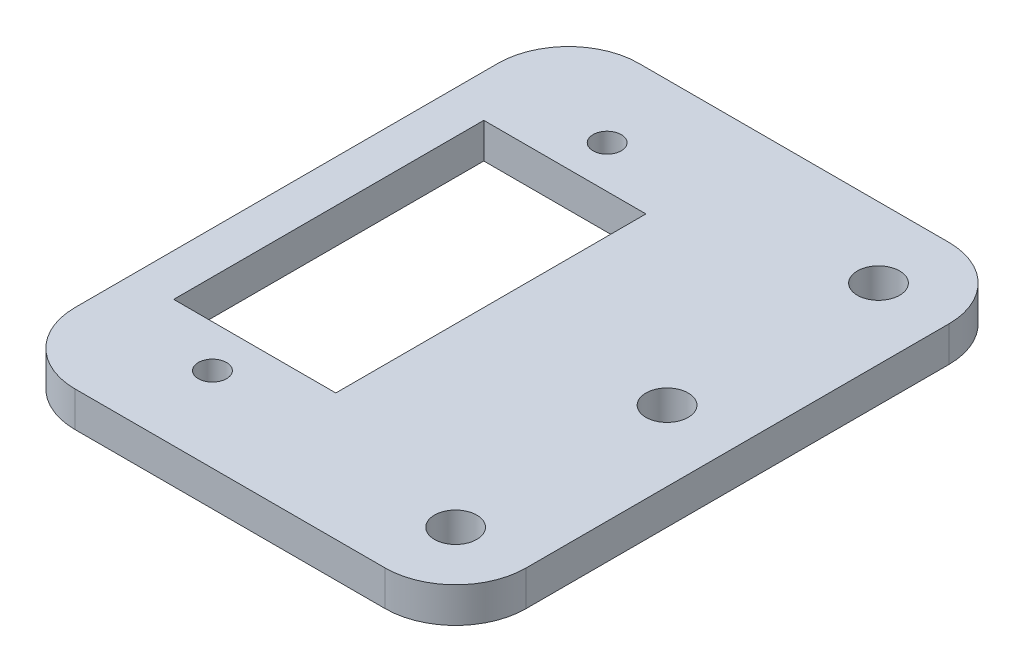
ISO-10303-21;
HEADER;
FILE_DESCRIPTION(('STEP AP214'),'2;1');
FILE_NAME('part.step','',(''),(''),'','','');
FILE_SCHEMA(('AUTOMOTIVE_DESIGN { 1 0 10303 214 1 1 1 1 }'));
ENDSEC;
DATA;
#1=APPLICATION_CONTEXT('core data for automotive mechanical design processes');
#2=APPLICATION_PROTOCOL_DEFINITION('international standard','automotive_design',2000,#1);
#3=PRODUCT_CONTEXT('',#1,'mechanical');
#4=PRODUCT('Part','Part','',(#3));
#5=PRODUCT_RELATED_PRODUCT_CATEGORY('part','',(#4));
#6=PRODUCT_DEFINITION_FORMATION('','',#4);
#7=PRODUCT_DEFINITION_CONTEXT('part definition',#1,'design');
#8=PRODUCT_DEFINITION('design','',#6,#7);
#9=PRODUCT_DEFINITION_SHAPE('','',#8);
#10=(LENGTH_UNIT() NAMED_UNIT(*) SI_UNIT(.MILLI.,.METRE.));
#11=(NAMED_UNIT(*) PLANE_ANGLE_UNIT() SI_UNIT($,.RADIAN.));
#12=(NAMED_UNIT(*) SI_UNIT($,.STERADIAN.) SOLID_ANGLE_UNIT());
#13=UNCERTAINTY_MEASURE_WITH_UNIT(LENGTH_MEASURE(1.E-05),#10,'distance_accuracy_value','');
#14=(GEOMETRIC_REPRESENTATION_CONTEXT(3) GLOBAL_UNCERTAINTY_ASSIGNED_CONTEXT((#13)) GLOBAL_UNIT_ASSIGNED_CONTEXT((#10,
#11,#12)) REPRESENTATION_CONTEXT('',''));
#15=CARTESIAN_POINT('',(0.,0.,0.));
#16=DIRECTION('',(0.,0.,1.));
#17=DIRECTION('',(1.,0.,0.));
#18=AXIS2_PLACEMENT_3D('',#15,#16,#17);
#19=CARTESIAN_POINT('',(0.,2.5,0.));
#20=DIRECTION('',(0.,1.,0.));
#21=DIRECTION('',(0.,0.,1.));
#22=AXIS2_PLACEMENT_3D('',#19,#20,#21);
#23=PLANE('',#22);
#24=DIRECTION('',(1.,0.,0.));
#25=VECTOR('',#24,1.);
#26=CARTESIAN_POINT('',(-13.,2.5,11.));
#27=LINE('',#26,#25);
#28=CARTESIAN_POINT('',(-13.,2.5,11.));
#29=VERTEX_POINT('',#28);
#30=CARTESIAN_POINT('',(-1.5,2.5,11.));
#31=VERTEX_POINT('',#30);
#32=EDGE_CURVE('E133',#29,#31,#27,.T.);
#33=ORIENTED_EDGE('',*,*,#32,.F.);
#34=DIRECTION('',(0.,0.,1.));
#35=VECTOR('',#34,1.);
#36=CARTESIAN_POINT('',(-13.,2.5,-11.));
#37=LINE('',#36,#35);
#38=CARTESIAN_POINT('',(-13.,2.5,-11.));
#39=VERTEX_POINT('',#38);
#40=EDGE_CURVE('E123',#39,#29,#37,.T.);
#41=ORIENTED_EDGE('',*,*,#40,.F.);
#42=DIRECTION('',(-1.,0.,0.));
#43=VECTOR('',#42,1.);
#44=CARTESIAN_POINT('',(-13.,2.5,-11.));
#45=LINE('',#44,#43);
#46=CARTESIAN_POINT('',(-1.5,2.5,-11.));
#47=VERTEX_POINT('',#46);
#48=EDGE_CURVE('E149',#47,#39,#45,.T.);
#49=ORIENTED_EDGE('',*,*,#48,.F.);
#50=DIRECTION('',(0.,0.,-1.));
#51=VECTOR('',#50,1.);
#52=CARTESIAN_POINT('',(-1.5,2.5,-11.));
#53=LINE('',#52,#51);
#54=EDGE_CURVE('E147',#31,#47,#53,.T.);
#55=ORIENTED_EDGE('',*,*,#54,.F.);
#56=EDGE_LOOP('',(#33,#41,#49,#55));
#57=FACE_BOUND('',#56,.T.);
#58=CARTESIAN_POINT('',(11.0000000000003,2.5,15.));
#59=DIRECTION('',(0.,1.,0.));
#60=DIRECTION('',(0.,0.,1.));
#61=AXIS2_PLACEMENT_3D('',#58,#59,#60);
#62=CIRCLE('',#61,1.5);
#63=CARTESIAN_POINT('',(11.0000000000003,2.5,16.5));
#64=VERTEX_POINT('',#63);
#65=EDGE_CURVE('E167',#64,#64,#62,.T.);
#66=ORIENTED_EDGE('',*,*,#65,.F.);
#67=EDGE_LOOP('',(#66));
#68=FACE_BOUND('',#67,.T.);
#69=CARTESIAN_POINT('',(-7.25,2.5,14.));
#70=DIRECTION('',(0.,1.,0.));
#71=DIRECTION('',(0.,0.,1.));
#72=AXIS2_PLACEMENT_3D('',#69,#70,#71);
#73=CIRCLE('',#72,1.);
#74=CARTESIAN_POINT('',(-7.25,2.5,15.));
#75=VERTEX_POINT('',#74);
#76=EDGE_CURVE('E179',#75,#75,#73,.T.);
#77=ORIENTED_EDGE('',*,*,#76,.F.);
#78=EDGE_LOOP('',(#77));
#79=FACE_BOUND('',#78,.T.);
#80=DIRECTION('',(-1.,0.,0.));
#81=VECTOR('',#80,1.);
#82=CARTESIAN_POINT('',(-16.,2.5,-20.));
#83=LINE('',#82,#81);
#84=CARTESIAN_POINT('',(11.,2.5,-20.));
#85=VERTEX_POINT('',#84);
#86=CARTESIAN_POINT('',(-11.,2.5,-20.));
#87=VERTEX_POINT('',#86);
#88=EDGE_CURVE('E199',#85,#87,#83,.T.);
#89=ORIENTED_EDGE('',*,*,#88,.T.);
#90=CARTESIAN_POINT('',(-11.,2.5,-15.));
#91=DIRECTION('',(0.,1.,0.));
#92=DIRECTION('',(0.,0.,1.));
#93=AXIS2_PLACEMENT_3D('',#90,#91,#92);
#94=CIRCLE('',#93,5.);
#95=CARTESIAN_POINT('',(-16.,2.5,-15.));
#96=VERTEX_POINT('',#95);
#97=EDGE_CURVE('E234',#87,#96,#94,.T.);
#98=ORIENTED_EDGE('',*,*,#97,.T.);
#99=DIRECTION('',(0.,0.,1.));
#100=VECTOR('',#99,1.);
#101=CARTESIAN_POINT('',(-16.,2.5,-20.));
#102=LINE('',#101,#100);
#103=CARTESIAN_POINT('',(-16.,2.5,15.));
#104=VERTEX_POINT('',#103);
#105=EDGE_CURVE('E191',#96,#104,#102,.T.);
#106=ORIENTED_EDGE('',*,*,#105,.T.);
#107=CARTESIAN_POINT('',(-11.,2.5,15.));
#108=DIRECTION('',(0.,1.,0.));
#109=DIRECTION('',(0.,0.,1.));
#110=AXIS2_PLACEMENT_3D('',#107,#108,#109);
#111=CIRCLE('',#110,5.);
#112=CARTESIAN_POINT('',(-11.,2.5,20.));
#113=VERTEX_POINT('',#112);
#114=EDGE_CURVE('E229',#104,#113,#111,.T.);
#115=ORIENTED_EDGE('',*,*,#114,.T.);
#116=DIRECTION('',(1.,0.,0.));
#117=VECTOR('',#116,1.);
#118=CARTESIAN_POINT('',(-16.,2.5,20.));
#119=LINE('',#118,#117);
#120=CARTESIAN_POINT('',(11.,2.5,20.));
#121=VERTEX_POINT('',#120);
#122=EDGE_CURVE('E194',#113,#121,#119,.T.);
#123=ORIENTED_EDGE('',*,*,#122,.T.);
#124=CARTESIAN_POINT('',(11.,2.5,15.));
#125=DIRECTION('',(0.,1.,0.));
#126=DIRECTION('',(0.,0.,1.));
#127=AXIS2_PLACEMENT_3D('',#124,#125,#126);
#128=CIRCLE('',#127,5.);
#129=CARTESIAN_POINT('',(16.,2.5,15.));
#130=VERTEX_POINT('',#129);
#131=EDGE_CURVE('E54',#121,#130,#128,.T.);
#132=ORIENTED_EDGE('',*,*,#131,.T.);
#133=DIRECTION('',(0.,0.,-1.));
#134=VECTOR('',#133,1.);
#135=CARTESIAN_POINT('',(16.,2.5,-20.));
#136=LINE('',#135,#134);
#137=CARTESIAN_POINT('',(16.,2.5,-15.));
#138=VERTEX_POINT('',#137);
#139=EDGE_CURVE('E197',#130,#138,#136,.T.);
#140=ORIENTED_EDGE('',*,*,#139,.T.);
#141=CARTESIAN_POINT('',(11.,2.5,-15.));
#142=DIRECTION('',(0.,1.,0.));
#143=DIRECTION('',(0.,0.,1.));
#144=AXIS2_PLACEMENT_3D('',#141,#142,#143);
#145=CIRCLE('',#144,5.);
#146=EDGE_CURVE('E232',#138,#85,#145,.T.);
#147=ORIENTED_EDGE('',*,*,#146,.T.);
#148=EDGE_LOOP('',(#89,#98,#106,#115,#123,#132,#140,#147));
#149=FACE_BOUND('',#148,.T.);
#150=CARTESIAN_POINT('',(11.,2.5,-15.));
#151=DIRECTION('',(0.,1.,0.));
#152=DIRECTION('',(0.,0.,1.));
#153=AXIS2_PLACEMENT_3D('',#150,#151,#152);
#154=CIRCLE('',#153,1.5);
#155=CARTESIAN_POINT('',(11.,2.5,-13.5));
#156=VERTEX_POINT('',#155);
#157=EDGE_CURVE('E185',#156,#156,#154,.T.);
#158=ORIENTED_EDGE('',*,*,#157,.F.);
#159=EDGE_LOOP('',(#158));
#160=FACE_BOUND('',#159,.T.);
#161=CARTESIAN_POINT('',(11.0000000000002,2.5,0.));
#162=DIRECTION('',(0.,1.,0.));
#163=DIRECTION('',(0.,0.,1.));
#164=AXIS2_PLACEMENT_3D('',#161,#162,#163);
#165=CIRCLE('',#164,1.5);
#166=CARTESIAN_POINT('',(11.0000000000002,2.5,1.5));
#167=VERTEX_POINT('',#166);
#168=EDGE_CURVE('E173',#167,#167,#165,.T.);
#169=ORIENTED_EDGE('',*,*,#168,.F.);
#170=EDGE_LOOP('',(#169));
#171=FACE_BOUND('',#170,.T.);
#172=CARTESIAN_POINT('',(-7.25,2.5,-14.));
#173=DIRECTION('',(0.,1.,0.));
#174=DIRECTION('',(0.,0.,-1.));
#175=AXIS2_PLACEMENT_3D('',#172,#173,#174);
#176=CIRCLE('',#175,1.);
#177=CARTESIAN_POINT('',(-7.25,2.5,-15.));
#178=VERTEX_POINT('',#177);
#179=EDGE_CURVE('E156',#178,#178,#176,.T.);
#180=ORIENTED_EDGE('',*,*,#179,.F.);
#181=EDGE_LOOP('',(#180));
#182=FACE_BOUND('',#181,.T.);
#183=ADVANCED_FACE('F32',(#57,#68,#79,#149,#160,#171,#182),#23,.T.);
#184=CARTESIAN_POINT('',(0.,0.,0.));
#185=DIRECTION('',(0.,1.,0.));
#186=DIRECTION('',(0.,0.,1.));
#187=AXIS2_PLACEMENT_3D('',#184,#185,#186);
#188=PLANE('',#187);
#189=CARTESIAN_POINT('',(11.0000000000003,0.,15.));
#190=DIRECTION('',(0.,1.,0.));
#191=DIRECTION('',(0.,0.,1.));
#192=AXIS2_PLACEMENT_3D('',#189,#190,#191);
#193=CIRCLE('',#192,1.5);
#194=CARTESIAN_POINT('',(11.0000000000003,0.,16.5));
#195=VERTEX_POINT('',#194);
#196=EDGE_CURVE('E141',#195,#195,#193,.T.);
#197=ORIENTED_EDGE('',*,*,#196,.T.);
#198=EDGE_LOOP('',(#197));
#199=FACE_BOUND('',#198,.T.);
#200=CARTESIAN_POINT('',(11.0000000000002,0.,0.));
#201=DIRECTION('',(0.,1.,0.));
#202=DIRECTION('',(0.,0.,1.));
#203=AXIS2_PLACEMENT_3D('',#200,#201,#202);
#204=CIRCLE('',#203,1.5);
#205=CARTESIAN_POINT('',(11.0000000000002,0.,1.5));
#206=VERTEX_POINT('',#205);
#207=EDGE_CURVE('E170',#206,#206,#204,.T.);
#208=ORIENTED_EDGE('',*,*,#207,.T.);
#209=EDGE_LOOP('',(#208));
#210=FACE_BOUND('',#209,.T.);
#211=CARTESIAN_POINT('',(-7.25,0.,14.));
#212=DIRECTION('',(0.,1.,0.));
#213=DIRECTION('',(0.,0.,1.));
#214=AXIS2_PLACEMENT_3D('',#211,#212,#213);
#215=CIRCLE('',#214,1.);
#216=CARTESIAN_POINT('',(-7.25,0.,15.));
#217=VERTEX_POINT('',#216);
#218=EDGE_CURVE('E176',#217,#217,#215,.T.);
#219=ORIENTED_EDGE('',*,*,#218,.T.);
#220=EDGE_LOOP('',(#219));
#221=FACE_BOUND('',#220,.T.);
#222=CARTESIAN_POINT('',(11.,0.,-15.));
#223=DIRECTION('',(0.,1.,0.));
#224=DIRECTION('',(0.,0.,1.));
#225=AXIS2_PLACEMENT_3D('',#222,#223,#224);
#226=CIRCLE('',#225,1.5);
#227=CARTESIAN_POINT('',(11.,0.,-13.5));
#228=VERTEX_POINT('',#227);
#229=EDGE_CURVE('E182',#228,#228,#226,.T.);
#230=ORIENTED_EDGE('',*,*,#229,.T.);
#231=EDGE_LOOP('',(#230));
#232=FACE_BOUND('',#231,.T.);
#233=DIRECTION('',(0.,0.,1.));
#234=VECTOR('',#233,1.);
#235=CARTESIAN_POINT('',(-16.,0.,-20.));
#236=LINE('',#235,#234);
#237=CARTESIAN_POINT('',(-16.,0.,-15.));
#238=VERTEX_POINT('',#237);
#239=CARTESIAN_POINT('',(-16.,0.,15.));
#240=VERTEX_POINT('',#239);
#241=EDGE_CURVE('E188',#238,#240,#236,.T.);
#242=ORIENTED_EDGE('',*,*,#241,.F.);
#243=CARTESIAN_POINT('',(-11.,0.,-15.));
#244=DIRECTION('',(0.,1.,0.));
#245=DIRECTION('',(0.,0.,1.));
#246=AXIS2_PLACEMENT_3D('',#243,#244,#245);
#247=CIRCLE('',#246,5.);
#248=CARTESIAN_POINT('',(-11.,0.,-20.));
#249=VERTEX_POINT('',#248);
#250=EDGE_CURVE('E222',#238,#249,#247,.F.);
#251=ORIENTED_EDGE('',*,*,#250,.T.);
#252=DIRECTION('',(-1.,0.,0.));
#253=VECTOR('',#252,1.);
#254=CARTESIAN_POINT('',(-16.,0.,-20.));
#255=LINE('',#254,#253);
#256=CARTESIAN_POINT('',(11.,0.,-20.));
#257=VERTEX_POINT('',#256);
#258=EDGE_CURVE('E195',#257,#249,#255,.T.);
#259=ORIENTED_EDGE('',*,*,#258,.F.);
#260=CARTESIAN_POINT('',(11.,0.,-15.));
#261=DIRECTION('',(0.,1.,0.));
#262=DIRECTION('',(0.,0.,1.));
#263=AXIS2_PLACEMENT_3D('',#260,#261,#262);
#264=CIRCLE('',#263,5.);
#265=CARTESIAN_POINT('',(16.,0.,-15.));
#266=VERTEX_POINT('',#265);
#267=EDGE_CURVE('E220',#257,#266,#264,.F.);
#268=ORIENTED_EDGE('',*,*,#267,.T.);
#269=DIRECTION('',(0.,0.,-1.));
#270=VECTOR('',#269,1.);
#271=CARTESIAN_POINT('',(16.,0.,-20.));
#272=LINE('',#271,#270);
#273=CARTESIAN_POINT('',(16.,0.,15.));
#274=VERTEX_POINT('',#273);
#275=EDGE_CURVE('E208',#274,#266,#272,.T.);
#276=ORIENTED_EDGE('',*,*,#275,.F.);
#277=CARTESIAN_POINT('',(11.,0.,15.));
#278=DIRECTION('',(0.,1.,0.));
#279=DIRECTION('',(0.,0.,1.));
#280=AXIS2_PLACEMENT_3D('',#277,#278,#279);
#281=CIRCLE('',#280,5.);
#282=CARTESIAN_POINT('',(11.,0.,20.));
#283=VERTEX_POINT('',#282);
#284=EDGE_CURVE('E218',#274,#283,#281,.F.);
#285=ORIENTED_EDGE('',*,*,#284,.T.);
#286=DIRECTION('',(1.,0.,0.));
#287=VECTOR('',#286,1.);
#288=CARTESIAN_POINT('',(-16.,0.,20.));
#289=LINE('',#288,#287);
#290=CARTESIAN_POINT('',(-11.,0.,20.));
#291=VERTEX_POINT('',#290);
#292=EDGE_CURVE('E205',#291,#283,#289,.T.);
#293=ORIENTED_EDGE('',*,*,#292,.F.);
#294=CARTESIAN_POINT('',(-11.,0.,15.));
#295=DIRECTION('',(0.,1.,0.));
#296=DIRECTION('',(0.,0.,1.));
#297=AXIS2_PLACEMENT_3D('',#294,#295,#296);
#298=CIRCLE('',#297,5.);
#299=EDGE_CURVE('E216',#291,#240,#298,.F.);
#300=ORIENTED_EDGE('',*,*,#299,.T.);
#301=EDGE_LOOP('',(#242,#251,#259,#268,#276,#285,#293,#300));
#302=FACE_BOUND('',#301,.T.);
#303=DIRECTION('',(0.,0.,1.));
#304=VECTOR('',#303,1.);
#305=CARTESIAN_POINT('',(-13.,0.,-11.));
#306=LINE('',#305,#304);
#307=CARTESIAN_POINT('',(-13.,0.,-11.));
#308=VERTEX_POINT('',#307);
#309=CARTESIAN_POINT('',(-13.,0.,11.));
#310=VERTEX_POINT('',#309);
#311=EDGE_CURVE('E154',#308,#310,#306,.T.);
#312=ORIENTED_EDGE('',*,*,#311,.T.);
#313=DIRECTION('',(1.,0.,0.));
#314=VECTOR('',#313,1.);
#315=CARTESIAN_POINT('',(-13.,0.,11.));
#316=LINE('',#315,#314);
#317=CARTESIAN_POINT('',(-1.5,0.,11.));
#318=VERTEX_POINT('',#317);
#319=EDGE_CURVE('E140',#310,#318,#316,.T.);
#320=ORIENTED_EDGE('',*,*,#319,.T.);
#321=DIRECTION('',(0.,0.,-1.));
#322=VECTOR('',#321,1.);
#323=CARTESIAN_POINT('',(-1.5,0.,-11.));
#324=LINE('',#323,#322);
#325=CARTESIAN_POINT('',(-1.5,0.,-11.));
#326=VERTEX_POINT('',#325);
#327=EDGE_CURVE('E158',#318,#326,#324,.T.);
#328=ORIENTED_EDGE('',*,*,#327,.T.);
#329=DIRECTION('',(-1.,0.,0.));
#330=VECTOR('',#329,1.);
#331=CARTESIAN_POINT('',(-13.,0.,-11.));
#332=LINE('',#331,#330);
#333=EDGE_CURVE('E134',#326,#308,#332,.T.);
#334=ORIENTED_EDGE('',*,*,#333,.T.);
#335=EDGE_LOOP('',(#312,#320,#328,#334));
#336=FACE_BOUND('',#335,.T.);
#337=CARTESIAN_POINT('',(-7.25,0.,-14.));
#338=DIRECTION('',(0.,1.,0.));
#339=DIRECTION('',(0.,0.,-1.));
#340=AXIS2_PLACEMENT_3D('',#337,#338,#339);
#341=CIRCLE('',#340,1.);
#342=CARTESIAN_POINT('',(-7.25,0.,-15.));
#343=VERTEX_POINT('',#342);
#344=EDGE_CURVE('E449',#343,#343,#341,.T.);
#345=ORIENTED_EDGE('',*,*,#344,.T.);
#346=EDGE_LOOP('',(#345));
#347=FACE_BOUND('',#346,.T.);
#348=ADVANCED_FACE('F250',(#199,#210,#221,#232,#302,#336,#347),#188,.F.);
#349=CARTESIAN_POINT('',(-16.,2.5,-20.));
#350=DIRECTION('',(1.,0.,0.));
#351=DIRECTION('',(0.,0.,-1.));
#352=AXIS2_PLACEMENT_3D('',#349,#350,#351);
#353=PLANE('',#352);
#354=ORIENTED_EDGE('',*,*,#105,.F.);
#355=DIRECTION('',(0.,-1.,0.));
#356=VECTOR('',#355,1.);
#357=CARTESIAN_POINT('',(-16.,2.5,-15.));
#358=LINE('',#357,#356);
#359=EDGE_CURVE('E213',#96,#238,#358,.T.);
#360=ORIENTED_EDGE('',*,*,#359,.T.);
#361=ORIENTED_EDGE('',*,*,#241,.T.);
#362=DIRECTION('',(0.,-1.,0.));
#363=VECTOR('',#362,1.);
#364=CARTESIAN_POINT('',(-16.,2.5,15.));
#365=LINE('',#364,#363);
#366=EDGE_CURVE('E202',#240,#104,#365,.F.);
#367=ORIENTED_EDGE('',*,*,#366,.T.);
#368=EDGE_LOOP('',(#354,#360,#361,#367));
#369=FACE_BOUND('',#368,.T.);
#370=ADVANCED_FACE('F273',(#369),#353,.F.);
#371=CARTESIAN_POINT('',(-16.,2.5,20.));
#372=DIRECTION('',(0.,0.,-1.));
#373=DIRECTION('',(-1.,0.,0.));
#374=AXIS2_PLACEMENT_3D('',#371,#372,#373);
#375=PLANE('',#374);
#376=ORIENTED_EDGE('',*,*,#292,.T.);
#377=DIRECTION('',(0.,-1.,0.));
#378=VECTOR('',#377,1.);
#379=CARTESIAN_POINT('',(11.,2.5,20.));
#380=LINE('',#379,#378);
#381=EDGE_CURVE('E11',#283,#121,#380,.F.);
#382=ORIENTED_EDGE('',*,*,#381,.T.);
#383=ORIENTED_EDGE('',*,*,#122,.F.);
#384=DIRECTION('',(0.,-1.,0.));
#385=VECTOR('',#384,1.);
#386=CARTESIAN_POINT('',(-11.,2.5,20.));
#387=LINE('',#386,#385);
#388=EDGE_CURVE('E40',#113,#291,#387,.T.);
#389=ORIENTED_EDGE('',*,*,#388,.T.);
#390=EDGE_LOOP('',(#376,#382,#383,#389));
#391=FACE_BOUND('',#390,.T.);
#392=ADVANCED_FACE('F244',(#391),#375,.F.);
#393=CARTESIAN_POINT('',(16.,2.5,-20.));
#394=DIRECTION('',(-1.,0.,0.));
#395=DIRECTION('',(0.,0.,1.));
#396=AXIS2_PLACEMENT_3D('',#393,#394,#395);
#397=PLANE('',#396);
#398=ORIENTED_EDGE('',*,*,#275,.T.);
#399=DIRECTION('',(0.,-1.,0.));
#400=VECTOR('',#399,1.);
#401=CARTESIAN_POINT('',(16.,2.5,-15.));
#402=LINE('',#401,#400);
#403=EDGE_CURVE('E47',#266,#138,#402,.F.);
#404=ORIENTED_EDGE('',*,*,#403,.T.);
#405=ORIENTED_EDGE('',*,*,#139,.F.);
#406=DIRECTION('',(0.,-1.,0.));
#407=VECTOR('',#406,1.);
#408=CARTESIAN_POINT('',(16.,2.5,15.));
#409=LINE('',#408,#407);
#410=EDGE_CURVE('E236',#130,#274,#409,.T.);
#411=ORIENTED_EDGE('',*,*,#410,.T.);
#412=EDGE_LOOP('',(#398,#404,#405,#411));
#413=FACE_BOUND('',#412,.T.);
#414=ADVANCED_FACE('F256',(#413),#397,.F.);
#415=CARTESIAN_POINT('',(-16.,2.5,-20.));
#416=DIRECTION('',(0.,0.,1.));
#417=DIRECTION('',(1.,0.,0.));
#418=AXIS2_PLACEMENT_3D('',#415,#416,#417);
#419=PLANE('',#418);
#420=ORIENTED_EDGE('',*,*,#258,.T.);
#421=DIRECTION('',(0.,-1.,0.));
#422=VECTOR('',#421,1.);
#423=CARTESIAN_POINT('',(-11.,2.5,-20.));
#424=LINE('',#423,#422);
#425=EDGE_CURVE('E227',#249,#87,#424,.F.);
#426=ORIENTED_EDGE('',*,*,#425,.T.);
#427=ORIENTED_EDGE('',*,*,#88,.F.);
#428=DIRECTION('',(0.,-1.,0.));
#429=VECTOR('',#428,1.);
#430=CARTESIAN_POINT('',(11.,2.5,-20.));
#431=LINE('',#430,#429);
#432=EDGE_CURVE('E224',#85,#257,#431,.T.);
#433=ORIENTED_EDGE('',*,*,#432,.T.);
#434=EDGE_LOOP('',(#420,#426,#427,#433));
#435=FACE_BOUND('',#434,.T.);
#436=ADVANCED_FACE('F265',(#435),#419,.F.);
#437=CARTESIAN_POINT('',(11.,2.5,-15.));
#438=DIRECTION('',(0.,-1.,0.));
#439=DIRECTION('',(0.,0.,-1.));
#440=AXIS2_PLACEMENT_3D('',#437,#438,#439);
#441=CYLINDRICAL_SURFACE('',#440,1.5);
#442=ORIENTED_EDGE('',*,*,#157,.T.);
#443=EDGE_LOOP('',(#442));
#444=FACE_BOUND('',#443,.T.);
#445=ORIENTED_EDGE('',*,*,#229,.F.);
#446=EDGE_LOOP('',(#445));
#447=FACE_BOUND('',#446,.T.);
#448=ADVANCED_FACE('F287',(#444,#447),#441,.F.);
#449=CARTESIAN_POINT('',(-7.25,2.5,14.));
#450=DIRECTION('',(0.,-1.,0.));
#451=DIRECTION('',(0.,0.,-1.));
#452=AXIS2_PLACEMENT_3D('',#449,#450,#451);
#453=CYLINDRICAL_SURFACE('',#452,1.);
#454=ORIENTED_EDGE('',*,*,#76,.T.);
#455=EDGE_LOOP('',(#454));
#456=FACE_BOUND('',#455,.T.);
#457=ORIENTED_EDGE('',*,*,#218,.F.);
#458=EDGE_LOOP('',(#457));
#459=FACE_BOUND('',#458,.T.);
#460=ADVANCED_FACE('F381',(#456,#459),#453,.F.);
#461=CARTESIAN_POINT('',(11.0000000000002,2.5,0.));
#462=DIRECTION('',(0.,-1.,0.));
#463=DIRECTION('',(0.,0.,-1.));
#464=AXIS2_PLACEMENT_3D('',#461,#462,#463);
#465=CYLINDRICAL_SURFACE('',#464,1.5);
#466=ORIENTED_EDGE('',*,*,#168,.T.);
#467=EDGE_LOOP('',(#466));
#468=FACE_BOUND('',#467,.T.);
#469=ORIENTED_EDGE('',*,*,#207,.F.);
#470=EDGE_LOOP('',(#469));
#471=FACE_BOUND('',#470,.T.);
#472=ADVANCED_FACE('F372',(#468,#471),#465,.F.);
#473=CARTESIAN_POINT('',(11.0000000000003,2.5,15.));
#474=DIRECTION('',(0.,-1.,0.));
#475=DIRECTION('',(0.,0.,-1.));
#476=AXIS2_PLACEMENT_3D('',#473,#474,#475);
#477=CYLINDRICAL_SURFACE('',#476,1.5);
#478=ORIENTED_EDGE('',*,*,#65,.T.);
#479=EDGE_LOOP('',(#478));
#480=FACE_BOUND('',#479,.T.);
#481=ORIENTED_EDGE('',*,*,#196,.F.);
#482=EDGE_LOOP('',(#481));
#483=FACE_BOUND('',#482,.T.);
#484=ADVANCED_FACE('F364',(#480,#483),#477,.F.);
#485=CARTESIAN_POINT('',(-13.,2.5,-11.));
#486=DIRECTION('',(1.,0.,0.));
#487=DIRECTION('',(0.,0.,-1.));
#488=AXIS2_PLACEMENT_3D('',#485,#486,#487);
#489=PLANE('',#488);
#490=ORIENTED_EDGE('',*,*,#311,.F.);
#491=DIRECTION('',(0.,-1.,0.));
#492=VECTOR('',#491,1.);
#493=CARTESIAN_POINT('',(-13.,2.5,-11.));
#494=LINE('',#493,#492);
#495=EDGE_CURVE('E129',#39,#308,#494,.T.);
#496=ORIENTED_EDGE('',*,*,#495,.F.);
#497=ORIENTED_EDGE('',*,*,#40,.T.);
#498=DIRECTION('',(0.,-1.,0.));
#499=VECTOR('',#498,1.);
#500=CARTESIAN_POINT('',(-13.,2.5,11.));
#501=LINE('',#500,#499);
#502=EDGE_CURVE('E126',#29,#310,#501,.T.);
#503=ORIENTED_EDGE('',*,*,#502,.T.);
#504=EDGE_LOOP('',(#490,#496,#497,#503));
#505=FACE_BOUND('',#504,.T.);
#506=ADVANCED_FACE('F125',(#505),#489,.T.);
#507=CARTESIAN_POINT('',(-13.,2.5,11.));
#508=DIRECTION('',(0.,0.,-1.));
#509=DIRECTION('',(-1.,0.,0.));
#510=AXIS2_PLACEMENT_3D('',#507,#508,#509);
#511=PLANE('',#510);
#512=ORIENTED_EDGE('',*,*,#319,.F.);
#513=ORIENTED_EDGE('',*,*,#502,.F.);
#514=ORIENTED_EDGE('',*,*,#32,.T.);
#515=DIRECTION('',(0.,-1.,0.));
#516=VECTOR('',#515,1.);
#517=CARTESIAN_POINT('',(-1.5,2.5,11.));
#518=LINE('',#517,#516);
#519=EDGE_CURVE('E142',#31,#318,#518,.T.);
#520=ORIENTED_EDGE('',*,*,#519,.T.);
#521=EDGE_LOOP('',(#512,#513,#514,#520));
#522=FACE_BOUND('',#521,.T.);
#523=ADVANCED_FACE('F137',(#522),#511,.T.);
#524=CARTESIAN_POINT('',(-1.5,2.5,-11.));
#525=DIRECTION('',(-1.,0.,0.));
#526=DIRECTION('',(0.,0.,1.));
#527=AXIS2_PLACEMENT_3D('',#524,#525,#526);
#528=PLANE('',#527);
#529=ORIENTED_EDGE('',*,*,#327,.F.);
#530=ORIENTED_EDGE('',*,*,#519,.F.);
#531=ORIENTED_EDGE('',*,*,#54,.T.);
#532=DIRECTION('',(0.,-1.,0.));
#533=VECTOR('',#532,1.);
#534=CARTESIAN_POINT('',(-1.5,2.5,-11.));
#535=LINE('',#534,#533);
#536=EDGE_CURVE('E164',#47,#326,#535,.T.);
#537=ORIENTED_EDGE('',*,*,#536,.T.);
#538=EDGE_LOOP('',(#529,#530,#531,#537));
#539=FACE_BOUND('',#538,.T.);
#540=ADVANCED_FACE('F340',(#539),#528,.T.);
#541=CARTESIAN_POINT('',(-13.,2.5,-11.));
#542=DIRECTION('',(0.,0.,1.));
#543=DIRECTION('',(1.,0.,0.));
#544=AXIS2_PLACEMENT_3D('',#541,#542,#543);
#545=PLANE('',#544);
#546=ORIENTED_EDGE('',*,*,#333,.F.);
#547=ORIENTED_EDGE('',*,*,#536,.F.);
#548=ORIENTED_EDGE('',*,*,#48,.T.);
#549=ORIENTED_EDGE('',*,*,#495,.T.);
#550=EDGE_LOOP('',(#546,#547,#548,#549));
#551=FACE_BOUND('',#550,.T.);
#552=ADVANCED_FACE('F331',(#551),#545,.T.);
#553=CARTESIAN_POINT('',(-7.25,2.5,-14.));
#554=DIRECTION('',(0.,-1.,0.));
#555=DIRECTION('',(0.,0.,-1.));
#556=AXIS2_PLACEMENT_3D('',#553,#554,#555);
#557=CYLINDRICAL_SURFACE('',#556,1.);
#558=ORIENTED_EDGE('',*,*,#179,.T.);
#559=EDGE_LOOP('',(#558));
#560=FACE_BOUND('',#559,.T.);
#561=ORIENTED_EDGE('',*,*,#344,.F.);
#562=EDGE_LOOP('',(#561));
#563=FACE_BOUND('',#562,.T.);
#564=ADVANCED_FACE('F300',(#560,#563),#557,.F.);
#565=CARTESIAN_POINT('',(-11.,2.5,-15.));
#566=DIRECTION('',(0.,-1.,0.));
#567=DIRECTION('',(0.,0.,-1.));
#568=AXIS2_PLACEMENT_3D('',#565,#566,#567);
#569=CYLINDRICAL_SURFACE('',#568,5.);
#570=ORIENTED_EDGE('',*,*,#97,.F.);
#571=ORIENTED_EDGE('',*,*,#425,.F.);
#572=ORIENTED_EDGE('',*,*,#250,.F.);
#573=ORIENTED_EDGE('',*,*,#359,.F.);
#574=EDGE_LOOP('',(#570,#571,#572,#573));
#575=FACE_BOUND('',#574,.T.);
#576=ADVANCED_FACE('F270',(#575),#569,.T.);
#577=CARTESIAN_POINT('',(11.,2.5,-15.));
#578=DIRECTION('',(0.,-1.,0.));
#579=DIRECTION('',(0.,0.,-1.));
#580=AXIS2_PLACEMENT_3D('',#577,#578,#579);
#581=CYLINDRICAL_SURFACE('',#580,5.);
#582=ORIENTED_EDGE('',*,*,#146,.F.);
#583=ORIENTED_EDGE('',*,*,#403,.F.);
#584=ORIENTED_EDGE('',*,*,#267,.F.);
#585=ORIENTED_EDGE('',*,*,#432,.F.);
#586=EDGE_LOOP('',(#582,#583,#584,#585));
#587=FACE_BOUND('',#586,.T.);
#588=ADVANCED_FACE('F262',(#587),#581,.T.);
#589=CARTESIAN_POINT('',(11.,2.5,15.));
#590=DIRECTION('',(0.,-1.,0.));
#591=DIRECTION('',(0.,0.,-1.));
#592=AXIS2_PLACEMENT_3D('',#589,#590,#591);
#593=CYLINDRICAL_SURFACE('',#592,5.);
#594=ORIENTED_EDGE('',*,*,#131,.F.);
#595=ORIENTED_EDGE('',*,*,#381,.F.);
#596=ORIENTED_EDGE('',*,*,#284,.F.);
#597=ORIENTED_EDGE('',*,*,#410,.F.);
#598=EDGE_LOOP('',(#594,#595,#596,#597));
#599=FACE_BOUND('',#598,.T.);
#600=ADVANCED_FACE('F255',(#599),#593,.T.);
#601=CARTESIAN_POINT('',(-11.,2.5,15.));
#602=DIRECTION('',(0.,-1.,0.));
#603=DIRECTION('',(0.,0.,-1.));
#604=AXIS2_PLACEMENT_3D('',#601,#602,#603);
#605=CYLINDRICAL_SURFACE('',#604,5.);
#606=ORIENTED_EDGE('',*,*,#114,.F.);
#607=ORIENTED_EDGE('',*,*,#366,.F.);
#608=ORIENTED_EDGE('',*,*,#299,.F.);
#609=ORIENTED_EDGE('',*,*,#388,.F.);
#610=EDGE_LOOP('',(#606,#607,#608,#609));
#611=FACE_BOUND('',#610,.T.);
#612=ADVANCED_FACE('F34',(#611),#605,.T.);
#613=CLOSED_SHELL('',(#183,#348,#370,#392,#414,#436,#448,#460,#472,#484,#506,#523,#540,#552,
#564,#576,#588,#600,#612));
#614=MANIFOLD_SOLID_BREP('B2',#613);
#615=ADVANCED_BREP_SHAPE_REPRESENTATION('',(#18,#614),#14);
#616=SHAPE_DEFINITION_REPRESENTATION(#9,#615);
ENDSEC;
END-ISO-10303-21;
